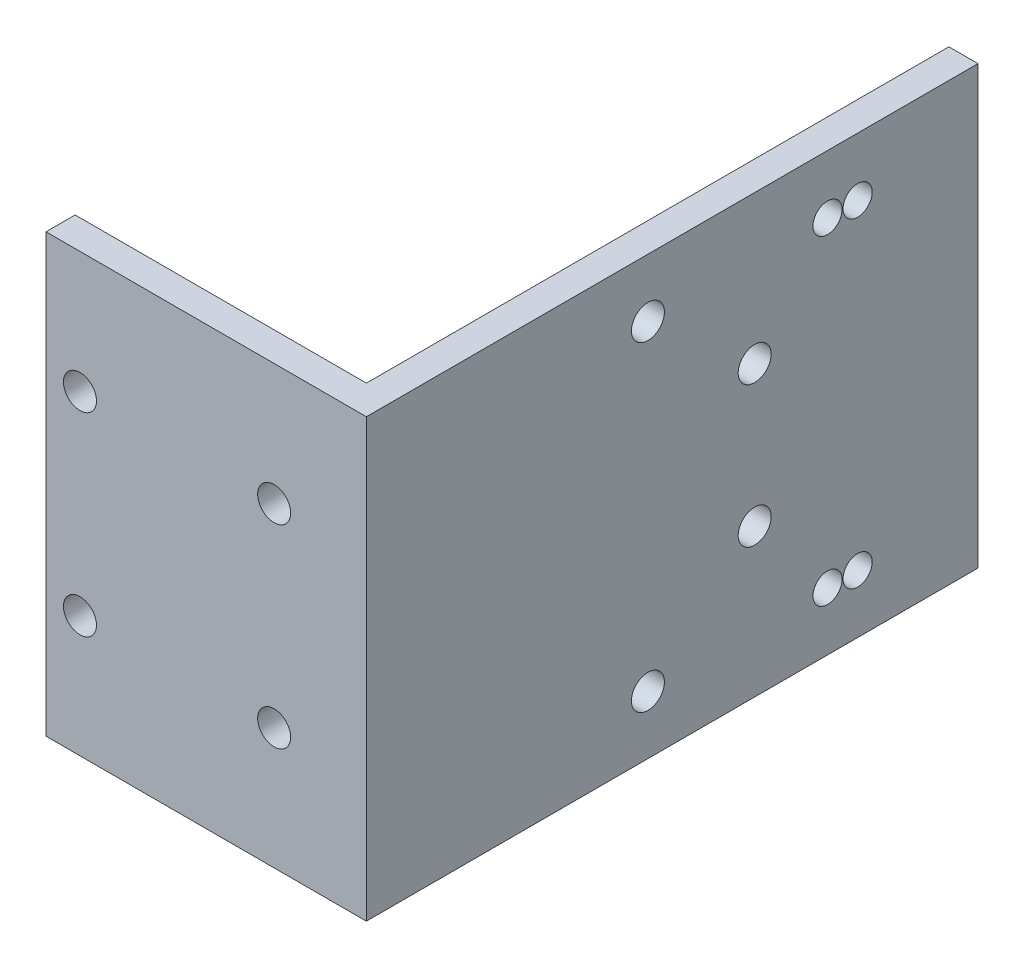
ISO-10303-21;
HEADER;
FILE_DESCRIPTION(('STEP AP214'),'2;1');
FILE_NAME('part.step','',(''),(''),'','','');
FILE_SCHEMA(('AUTOMOTIVE_DESIGN { 1 0 10303 214 1 1 1 1 }'));
ENDSEC;
DATA;
#1=APPLICATION_CONTEXT('core data for automotive mechanical design processes');
#2=APPLICATION_PROTOCOL_DEFINITION('international standard','automotive_design',2000,#1);
#3=PRODUCT_CONTEXT('',#1,'mechanical');
#4=PRODUCT('Part','Part','',(#3));
#5=PRODUCT_RELATED_PRODUCT_CATEGORY('part','',(#4));
#6=PRODUCT_DEFINITION_FORMATION('','',#4);
#7=PRODUCT_DEFINITION_CONTEXT('part definition',#1,'design');
#8=PRODUCT_DEFINITION('design','',#6,#7);
#9=PRODUCT_DEFINITION_SHAPE('','',#8);
#10=(LENGTH_UNIT() NAMED_UNIT(*) SI_UNIT(.MILLI.,.METRE.));
#11=(NAMED_UNIT(*) PLANE_ANGLE_UNIT() SI_UNIT($,.RADIAN.));
#12=(NAMED_UNIT(*) SI_UNIT($,.STERADIAN.) SOLID_ANGLE_UNIT());
#13=UNCERTAINTY_MEASURE_WITH_UNIT(LENGTH_MEASURE(1.E-05),#10,'distance_accuracy_value','');
#14=(GEOMETRIC_REPRESENTATION_CONTEXT(3) GLOBAL_UNCERTAINTY_ASSIGNED_CONTEXT((#13)) GLOBAL_UNIT_ASSIGNED_CONTEXT((#10,
#11,#12)) REPRESENTATION_CONTEXT('',''));
#15=CARTESIAN_POINT('',(0.,0.,0.));
#16=DIRECTION('',(0.,0.,1.));
#17=DIRECTION('',(1.,0.,0.));
#18=AXIS2_PLACEMENT_3D('',#15,#16,#17);
#19=CARTESIAN_POINT('',(0.,45.,0.));
#20=DIRECTION('',(1.,0.,0.));
#21=DIRECTION('',(0.,0.,-1.));
#22=AXIS2_PLACEMENT_3D('',#19,#20,#21);
#23=PLANE('',#22);
#24=DIRECTION('',(0.,0.,1.));
#25=VECTOR('',#24,1.);
#26=CARTESIAN_POINT('',(0.,0.,0.));
#27=LINE('',#26,#25);
#28=CARTESIAN_POINT('',(0.,0.,0.));
#29=VERTEX_POINT('',#28);
#30=CARTESIAN_POINT('',(0.,0.,3.));
#31=VERTEX_POINT('',#30);
#32=EDGE_CURVE('E119',#29,#31,#27,.T.);
#33=ORIENTED_EDGE('',*,*,#32,.T.);
#34=DIRECTION('',(0.,-1.,0.));
#35=VECTOR('',#34,1.);
#36=CARTESIAN_POINT('',(0.,45.,3.));
#37=LINE('',#36,#35);
#38=CARTESIAN_POINT('',(0.,45.,3.));
#39=VERTEX_POINT('',#38);
#40=EDGE_CURVE('E11',#39,#31,#37,.T.);
#41=ORIENTED_EDGE('',*,*,#40,.F.);
#42=DIRECTION('',(0.,0.,1.));
#43=VECTOR('',#42,1.);
#44=CARTESIAN_POINT('',(0.,45.,0.));
#45=LINE('',#44,#43);
#46=CARTESIAN_POINT('',(0.,45.,0.));
#47=VERTEX_POINT('',#46);
#48=EDGE_CURVE('E130',#47,#39,#45,.T.);
#49=ORIENTED_EDGE('',*,*,#48,.F.);
#50=DIRECTION('',(0.,-1.,0.));
#51=VECTOR('',#50,1.);
#52=CARTESIAN_POINT('',(0.,45.,0.));
#53=LINE('',#52,#51);
#54=EDGE_CURVE('E115',#47,#29,#53,.T.);
#55=ORIENTED_EDGE('',*,*,#54,.T.);
#56=EDGE_LOOP('',(#33,#41,#49,#55));
#57=FACE_BOUND('',#56,.T.);
#58=ADVANCED_FACE('F35',(#57),#23,.F.);
#59=CARTESIAN_POINT('',(0.,45.,3.));
#60=DIRECTION('',(0.,0.,-1.));
#61=DIRECTION('',(-1.,0.,0.));
#62=AXIS2_PLACEMENT_3D('',#59,#60,#61);
#63=PLANE('',#62);
#64=CARTESIAN_POINT('',(3.5,12.5,3.));
#65=DIRECTION('',(0.,0.,1.));
#66=DIRECTION('',(1.,0.,0.));
#67=AXIS2_PLACEMENT_3D('',#64,#65,#66);
#68=CIRCLE('',#67,1.7);
#69=CARTESIAN_POINT('',(5.2,12.5,3.));
#70=VERTEX_POINT('',#69);
#71=EDGE_CURVE('E364',#70,#70,#68,.T.);
#72=ORIENTED_EDGE('',*,*,#71,.F.);
#73=EDGE_LOOP('',(#72));
#74=FACE_BOUND('',#73,.T.);
#75=CARTESIAN_POINT('',(23.5,12.5,3.));
#76=DIRECTION('',(0.,0.,1.));
#77=DIRECTION('',(1.,0.,0.));
#78=AXIS2_PLACEMENT_3D('',#75,#76,#77);
#79=CIRCLE('',#78,1.7);
#80=CARTESIAN_POINT('',(25.2,12.5,3.));
#81=VERTEX_POINT('',#80);
#82=EDGE_CURVE('E358',#81,#81,#79,.T.);
#83=ORIENTED_EDGE('',*,*,#82,.F.);
#84=EDGE_LOOP('',(#83));
#85=FACE_BOUND('',#84,.T.);
#86=CARTESIAN_POINT('',(23.5,32.5,3.));
#87=DIRECTION('',(0.,0.,1.));
#88=DIRECTION('',(1.,0.,0.));
#89=AXIS2_PLACEMENT_3D('',#86,#87,#88);
#90=CIRCLE('',#89,1.7);
#91=CARTESIAN_POINT('',(25.2,32.5,3.));
#92=VERTEX_POINT('',#91);
#93=EDGE_CURVE('E352',#92,#92,#90,.T.);
#94=ORIENTED_EDGE('',*,*,#93,.F.);
#95=EDGE_LOOP('',(#94));
#96=FACE_BOUND('',#95,.T.);
#97=CARTESIAN_POINT('',(3.5,32.5,3.));
#98=DIRECTION('',(0.,0.,1.));
#99=DIRECTION('',(1.,0.,0.));
#100=AXIS2_PLACEMENT_3D('',#97,#98,#99);
#101=CIRCLE('',#100,1.7);
#102=CARTESIAN_POINT('',(5.2,32.5,3.));
#103=VERTEX_POINT('',#102);
#104=EDGE_CURVE('E340',#103,#103,#101,.T.);
#105=ORIENTED_EDGE('',*,*,#104,.F.);
#106=EDGE_LOOP('',(#105));
#107=FACE_BOUND('',#106,.T.);
#108=DIRECTION('',(1.,0.,0.));
#109=VECTOR('',#108,1.);
#110=CARTESIAN_POINT('',(0.,0.,3.));
#111=LINE('',#110,#109);
#112=CARTESIAN_POINT('',(33.,0.,3.));
#113=VERTEX_POINT('',#112);
#114=EDGE_CURVE('E122',#31,#113,#111,.T.);
#115=ORIENTED_EDGE('',*,*,#114,.T.);
#116=DIRECTION('',(0.,-1.,0.));
#117=VECTOR('',#116,1.);
#118=CARTESIAN_POINT('',(33.,45.,3.));
#119=LINE('',#118,#117);
#120=CARTESIAN_POINT('',(33.,45.,3.));
#121=VERTEX_POINT('',#120);
#122=EDGE_CURVE('E43',#121,#113,#119,.T.);
#123=ORIENTED_EDGE('',*,*,#122,.F.);
#124=DIRECTION('',(1.,0.,0.));
#125=VECTOR('',#124,1.);
#126=CARTESIAN_POINT('',(0.,45.,3.));
#127=LINE('',#126,#125);
#128=EDGE_CURVE('E88',#39,#121,#127,.T.);
#129=ORIENTED_EDGE('',*,*,#128,.F.);
#130=ORIENTED_EDGE('',*,*,#40,.T.);
#131=EDGE_LOOP('',(#115,#123,#129,#130));
#132=FACE_BOUND('',#131,.T.);
#133=ADVANCED_FACE('F158',(#74,#85,#96,#107,#132),#63,.F.);
#134=CARTESIAN_POINT('',(33.,45.,3.));
#135=DIRECTION('',(-1.,0.,0.));
#136=DIRECTION('',(0.,0.,1.));
#137=AXIS2_PLACEMENT_3D('',#134,#135,#136);
#138=PLANE('',#137);
#139=CARTESIAN_POINT('',(33.,6.00000000000001,-44.5));
#140=DIRECTION('',(1.,0.,0.));
#141=DIRECTION('',(0.,0.,1.));
#142=AXIS2_PLACEMENT_3D('',#139,#140,#141);
#143=CIRCLE('',#142,1.5);
#144=CARTESIAN_POINT('',(33.,6.00000000000001,-43.));
#145=VERTEX_POINT('',#144);
#146=EDGE_CURVE('E412',#145,#145,#143,.T.);
#147=ORIENTED_EDGE('',*,*,#146,.F.);
#148=EDGE_LOOP('',(#147));
#149=FACE_BOUND('',#148,.T.);
#150=CARTESIAN_POINT('',(33.,6.00000000000001,-47.6));
#151=DIRECTION('',(1.,0.,0.));
#152=DIRECTION('',(0.,0.,1.));
#153=AXIS2_PLACEMENT_3D('',#150,#151,#152);
#154=CIRCLE('',#153,1.5);
#155=CARTESIAN_POINT('',(33.,6.00000000000001,-46.1));
#156=VERTEX_POINT('',#155);
#157=EDGE_CURVE('E406',#156,#156,#154,.T.);
#158=ORIENTED_EDGE('',*,*,#157,.F.);
#159=EDGE_LOOP('',(#158));
#160=FACE_BOUND('',#159,.T.);
#161=CARTESIAN_POINT('',(33.,39.,-47.6));
#162=DIRECTION('',(1.,0.,0.));
#163=DIRECTION('',(0.,0.,-1.));
#164=AXIS2_PLACEMENT_3D('',#161,#162,#163);
#165=CIRCLE('',#164,1.5);
#166=CARTESIAN_POINT('',(33.,39.,-49.1));
#167=VERTEX_POINT('',#166);
#168=EDGE_CURVE('E400',#167,#167,#165,.T.);
#169=ORIENTED_EDGE('',*,*,#168,.F.);
#170=EDGE_LOOP('',(#169));
#171=FACE_BOUND('',#170,.T.);
#172=CARTESIAN_POINT('',(33.,39.,-44.5));
#173=DIRECTION('',(1.,0.,0.));
#174=DIRECTION('',(0.,0.,-1.));
#175=AXIS2_PLACEMENT_3D('',#172,#173,#174);
#176=CIRCLE('',#175,1.5);
#177=CARTESIAN_POINT('',(33.,39.,-46.));
#178=VERTEX_POINT('',#177);
#179=EDGE_CURVE('E394',#178,#178,#176,.T.);
#180=ORIENTED_EDGE('',*,*,#179,.F.);
#181=EDGE_LOOP('',(#180));
#182=FACE_BOUND('',#181,.T.);
#183=CARTESIAN_POINT('',(33.,29.75,-37.));
#184=DIRECTION('',(1.,0.,0.));
#185=DIRECTION('',(0.,0.,-1.));
#186=AXIS2_PLACEMENT_3D('',#183,#184,#185);
#187=CIRCLE('',#186,1.7);
#188=CARTESIAN_POINT('',(33.,29.75,-38.7));
#189=VERTEX_POINT('',#188);
#190=EDGE_CURVE('E388',#189,#189,#187,.T.);
#191=ORIENTED_EDGE('',*,*,#190,.F.);
#192=EDGE_LOOP('',(#191));
#193=FACE_BOUND('',#192,.T.);
#194=CARTESIAN_POINT('',(33.,15.25,-37.));
#195=DIRECTION('',(1.,0.,0.));
#196=DIRECTION('',(0.,0.,-1.));
#197=AXIS2_PLACEMENT_3D('',#194,#195,#196);
#198=CIRCLE('',#197,1.7);
#199=CARTESIAN_POINT('',(33.,15.25,-38.7));
#200=VERTEX_POINT('',#199);
#201=EDGE_CURVE('E382',#200,#200,#198,.T.);
#202=ORIENTED_EDGE('',*,*,#201,.F.);
#203=EDGE_LOOP('',(#202));
#204=FACE_BOUND('',#203,.T.);
#205=CARTESIAN_POINT('',(33.,39.,-26.));
#206=DIRECTION('',(1.,0.,0.));
#207=DIRECTION('',(0.,0.,-1.));
#208=AXIS2_PLACEMENT_3D('',#205,#206,#207);
#209=CIRCLE('',#208,1.7);
#210=CARTESIAN_POINT('',(33.,39.,-27.7));
#211=VERTEX_POINT('',#210);
#212=EDGE_CURVE('E376',#211,#211,#209,.T.);
#213=ORIENTED_EDGE('',*,*,#212,.F.);
#214=EDGE_LOOP('',(#213));
#215=FACE_BOUND('',#214,.T.);
#216=CARTESIAN_POINT('',(33.,6.,-26.));
#217=DIRECTION('',(1.,0.,0.));
#218=DIRECTION('',(0.,0.,-1.));
#219=AXIS2_PLACEMENT_3D('',#216,#217,#218);
#220=CIRCLE('',#219,1.7);
#221=CARTESIAN_POINT('',(33.,6.,-27.7));
#222=VERTEX_POINT('',#221);
#223=EDGE_CURVE('E370',#222,#222,#220,.T.);
#224=ORIENTED_EDGE('',*,*,#223,.F.);
#225=EDGE_LOOP('',(#224));
#226=FACE_BOUND('',#225,.T.);
#227=DIRECTION('',(0.,0.,-1.));
#228=VECTOR('',#227,1.);
#229=CARTESIAN_POINT('',(33.,0.,3.));
#230=LINE('',#229,#228);
#231=CARTESIAN_POINT('',(33.,0.,-60.));
#232=VERTEX_POINT('',#231);
#233=EDGE_CURVE('E125',#113,#232,#230,.T.);
#234=ORIENTED_EDGE('',*,*,#233,.T.);
#235=DIRECTION('',(0.,-1.,0.));
#236=VECTOR('',#235,1.);
#237=CARTESIAN_POINT('',(33.,45.,-60.));
#238=LINE('',#237,#236);
#239=CARTESIAN_POINT('',(33.,45.,-60.));
#240=VERTEX_POINT('',#239);
#241=EDGE_CURVE('E110',#240,#232,#238,.T.);
#242=ORIENTED_EDGE('',*,*,#241,.F.);
#243=DIRECTION('',(0.,0.,-1.));
#244=VECTOR('',#243,1.);
#245=CARTESIAN_POINT('',(33.,45.,3.));
#246=LINE('',#245,#244);
#247=EDGE_CURVE('E101',#121,#240,#246,.T.);
#248=ORIENTED_EDGE('',*,*,#247,.F.);
#249=ORIENTED_EDGE('',*,*,#122,.T.);
#250=EDGE_LOOP('',(#234,#242,#248,#249));
#251=FACE_BOUND('',#250,.T.);
#252=ADVANCED_FACE('F136',(#149,#160,#171,#182,#193,#204,#215,#226,#251),#138,.F.);
#253=CARTESIAN_POINT('',(30.,45.,-60.));
#254=DIRECTION('',(0.,0.,1.));
#255=DIRECTION('',(1.,0.,0.));
#256=AXIS2_PLACEMENT_3D('',#253,#254,#255);
#257=PLANE('',#256);
#258=DIRECTION('',(-1.,0.,0.));
#259=VECTOR('',#258,1.);
#260=CARTESIAN_POINT('',(30.,0.,-60.));
#261=LINE('',#260,#259);
#262=CARTESIAN_POINT('',(30.,0.,-60.));
#263=VERTEX_POINT('',#262);
#264=EDGE_CURVE('E109',#232,#263,#261,.T.);
#265=ORIENTED_EDGE('',*,*,#264,.T.);
#266=DIRECTION('',(0.,-1.,0.));
#267=VECTOR('',#266,1.);
#268=CARTESIAN_POINT('',(30.,45.,-60.));
#269=LINE('',#268,#267);
#270=CARTESIAN_POINT('',(30.,45.,-60.));
#271=VERTEX_POINT('',#270);
#272=EDGE_CURVE('E106',#271,#263,#269,.T.);
#273=ORIENTED_EDGE('',*,*,#272,.F.);
#274=DIRECTION('',(-1.,0.,0.));
#275=VECTOR('',#274,1.);
#276=CARTESIAN_POINT('',(30.,45.,-60.));
#277=LINE('',#276,#275);
#278=EDGE_CURVE('E95',#240,#271,#277,.T.);
#279=ORIENTED_EDGE('',*,*,#278,.F.);
#280=ORIENTED_EDGE('',*,*,#241,.T.);
#281=EDGE_LOOP('',(#265,#273,#279,#280));
#282=FACE_BOUND('',#281,.T.);
#283=ADVANCED_FACE('F107',(#282),#257,.F.);
#284=CARTESIAN_POINT('',(30.,45.,0.));
#285=DIRECTION('',(1.,0.,0.));
#286=DIRECTION('',(0.,0.,-1.));
#287=AXIS2_PLACEMENT_3D('',#284,#285,#286);
#288=PLANE('',#287);
#289=CARTESIAN_POINT('',(30.,6.00000000000001,-44.5));
#290=DIRECTION('',(1.,0.,0.));
#291=DIRECTION('',(0.,0.,-1.));
#292=AXIS2_PLACEMENT_3D('',#289,#290,#291);
#293=CIRCLE('',#292,1.5);
#294=CARTESIAN_POINT('',(30.,6.00000000000001,-46.));
#295=VERTEX_POINT('',#294);
#296=EDGE_CURVE('E409',#295,#295,#293,.F.);
#297=ORIENTED_EDGE('',*,*,#296,.F.);
#298=EDGE_LOOP('',(#297));
#299=FACE_BOUND('',#298,.T.);
#300=CARTESIAN_POINT('',(30.,6.00000000000001,-47.6));
#301=DIRECTION('',(1.,0.,0.));
#302=DIRECTION('',(0.,0.,-1.));
#303=AXIS2_PLACEMENT_3D('',#300,#301,#302);
#304=CIRCLE('',#303,1.5);
#305=CARTESIAN_POINT('',(30.,6.00000000000001,-49.1));
#306=VERTEX_POINT('',#305);
#307=EDGE_CURVE('E403',#306,#306,#304,.F.);
#308=ORIENTED_EDGE('',*,*,#307,.F.);
#309=EDGE_LOOP('',(#308));
#310=FACE_BOUND('',#309,.T.);
#311=CARTESIAN_POINT('',(30.,39.,-47.6));
#312=DIRECTION('',(1.,0.,0.));
#313=DIRECTION('',(0.,0.,-1.));
#314=AXIS2_PLACEMENT_3D('',#311,#312,#313);
#315=CIRCLE('',#314,1.5);
#316=CARTESIAN_POINT('',(30.,39.,-49.1));
#317=VERTEX_POINT('',#316);
#318=EDGE_CURVE('E397',#317,#317,#315,.F.);
#319=ORIENTED_EDGE('',*,*,#318,.F.);
#320=EDGE_LOOP('',(#319));
#321=FACE_BOUND('',#320,.T.);
#322=CARTESIAN_POINT('',(30.,39.,-44.5));
#323=DIRECTION('',(1.,0.,0.));
#324=DIRECTION('',(0.,0.,-1.));
#325=AXIS2_PLACEMENT_3D('',#322,#323,#324);
#326=CIRCLE('',#325,1.5);
#327=CARTESIAN_POINT('',(30.,39.,-46.));
#328=VERTEX_POINT('',#327);
#329=EDGE_CURVE('E391',#328,#328,#326,.F.);
#330=ORIENTED_EDGE('',*,*,#329,.F.);
#331=EDGE_LOOP('',(#330));
#332=FACE_BOUND('',#331,.T.);
#333=CARTESIAN_POINT('',(30.,29.75,-37.));
#334=DIRECTION('',(1.,0.,0.));
#335=DIRECTION('',(0.,0.,-1.));
#336=AXIS2_PLACEMENT_3D('',#333,#334,#335);
#337=CIRCLE('',#336,1.7);
#338=CARTESIAN_POINT('',(30.,29.75,-38.7));
#339=VERTEX_POINT('',#338);
#340=EDGE_CURVE('E385',#339,#339,#337,.F.);
#341=ORIENTED_EDGE('',*,*,#340,.F.);
#342=EDGE_LOOP('',(#341));
#343=FACE_BOUND('',#342,.T.);
#344=CARTESIAN_POINT('',(30.,15.25,-37.));
#345=DIRECTION('',(1.,0.,0.));
#346=DIRECTION('',(0.,0.,-1.));
#347=AXIS2_PLACEMENT_3D('',#344,#345,#346);
#348=CIRCLE('',#347,1.7);
#349=CARTESIAN_POINT('',(30.,15.25,-38.7));
#350=VERTEX_POINT('',#349);
#351=EDGE_CURVE('E379',#350,#350,#348,.F.);
#352=ORIENTED_EDGE('',*,*,#351,.F.);
#353=EDGE_LOOP('',(#352));
#354=FACE_BOUND('',#353,.T.);
#355=CARTESIAN_POINT('',(30.,39.,-26.));
#356=DIRECTION('',(1.,0.,0.));
#357=DIRECTION('',(0.,0.,-1.));
#358=AXIS2_PLACEMENT_3D('',#355,#356,#357);
#359=CIRCLE('',#358,1.7);
#360=CARTESIAN_POINT('',(30.,39.,-27.7));
#361=VERTEX_POINT('',#360);
#362=EDGE_CURVE('E373',#361,#361,#359,.F.);
#363=ORIENTED_EDGE('',*,*,#362,.F.);
#364=EDGE_LOOP('',(#363));
#365=FACE_BOUND('',#364,.T.);
#366=CARTESIAN_POINT('',(30.,6.,-26.));
#367=DIRECTION('',(1.,0.,0.));
#368=DIRECTION('',(0.,0.,-1.));
#369=AXIS2_PLACEMENT_3D('',#366,#367,#368);
#370=CIRCLE('',#369,1.7);
#371=CARTESIAN_POINT('',(30.,6.,-27.7));
#372=VERTEX_POINT('',#371);
#373=EDGE_CURVE('E367',#372,#372,#370,.F.);
#374=ORIENTED_EDGE('',*,*,#373,.F.);
#375=EDGE_LOOP('',(#374));
#376=FACE_BOUND('',#375,.T.);
#377=DIRECTION('',(0.,0.,1.));
#378=VECTOR('',#377,1.);
#379=CARTESIAN_POINT('',(30.,0.,0.));
#380=LINE('',#379,#378);
#381=CARTESIAN_POINT('',(30.,0.,0.));
#382=VERTEX_POINT('',#381);
#383=EDGE_CURVE('E74',#263,#382,#380,.T.);
#384=ORIENTED_EDGE('',*,*,#383,.T.);
#385=DIRECTION('',(0.,-1.,0.));
#386=VECTOR('',#385,1.);
#387=CARTESIAN_POINT('',(30.,45.,0.));
#388=LINE('',#387,#386);
#389=CARTESIAN_POINT('',(30.,45.,0.));
#390=VERTEX_POINT('',#389);
#391=EDGE_CURVE('E111',#390,#382,#388,.T.);
#392=ORIENTED_EDGE('',*,*,#391,.F.);
#393=DIRECTION('',(0.,0.,1.));
#394=VECTOR('',#393,1.);
#395=CARTESIAN_POINT('',(30.,45.,0.));
#396=LINE('',#395,#394);
#397=EDGE_CURVE('E99',#271,#390,#396,.T.);
#398=ORIENTED_EDGE('',*,*,#397,.F.);
#399=ORIENTED_EDGE('',*,*,#272,.T.);
#400=EDGE_LOOP('',(#384,#392,#398,#399));
#401=FACE_BOUND('',#400,.T.);
#402=ADVANCED_FACE('F113',(#299,#310,#321,#332,#343,#354,#365,#376,#401),#288,.F.);
#403=CARTESIAN_POINT('',(0.,45.,0.));
#404=DIRECTION('',(0.,0.,1.));
#405=DIRECTION('',(1.,0.,0.));
#406=AXIS2_PLACEMENT_3D('',#403,#404,#405);
#407=PLANE('',#406);
#408=CARTESIAN_POINT('',(3.5,12.5,0.));
#409=DIRECTION('',(0.,0.,1.));
#410=DIRECTION('',(1.,0.,0.));
#411=AXIS2_PLACEMENT_3D('',#408,#409,#410);
#412=CIRCLE('',#411,1.7);
#413=CARTESIAN_POINT('',(5.2,12.5,0.));
#414=VERTEX_POINT('',#413);
#415=EDGE_CURVE('E361',#414,#414,#412,.F.);
#416=ORIENTED_EDGE('',*,*,#415,.F.);
#417=EDGE_LOOP('',(#416));
#418=FACE_BOUND('',#417,.T.);
#419=CARTESIAN_POINT('',(23.5,12.5,0.));
#420=DIRECTION('',(0.,0.,1.));
#421=DIRECTION('',(1.,0.,0.));
#422=AXIS2_PLACEMENT_3D('',#419,#420,#421);
#423=CIRCLE('',#422,1.7);
#424=CARTESIAN_POINT('',(25.2,12.5,0.));
#425=VERTEX_POINT('',#424);
#426=EDGE_CURVE('E355',#425,#425,#423,.F.);
#427=ORIENTED_EDGE('',*,*,#426,.F.);
#428=EDGE_LOOP('',(#427));
#429=FACE_BOUND('',#428,.T.);
#430=CARTESIAN_POINT('',(23.5,32.5,0.));
#431=DIRECTION('',(0.,0.,1.));
#432=DIRECTION('',(1.,0.,0.));
#433=AXIS2_PLACEMENT_3D('',#430,#431,#432);
#434=CIRCLE('',#433,1.7);
#435=CARTESIAN_POINT('',(25.2,32.5,0.));
#436=VERTEX_POINT('',#435);
#437=EDGE_CURVE('E345',#436,#436,#434,.F.);
#438=ORIENTED_EDGE('',*,*,#437,.F.);
#439=EDGE_LOOP('',(#438));
#440=FACE_BOUND('',#439,.T.);
#441=CARTESIAN_POINT('',(3.5,32.5,0.));
#442=DIRECTION('',(0.,0.,1.));
#443=DIRECTION('',(1.,0.,0.));
#444=AXIS2_PLACEMENT_3D('',#441,#442,#443);
#445=CIRCLE('',#444,1.7);
#446=CARTESIAN_POINT('',(5.2,32.5,0.));
#447=VERTEX_POINT('',#446);
#448=EDGE_CURVE('E123',#447,#447,#445,.F.);
#449=ORIENTED_EDGE('',*,*,#448,.F.);
#450=EDGE_LOOP('',(#449));
#451=FACE_BOUND('',#450,.T.);
#452=DIRECTION('',(-1.,0.,0.));
#453=VECTOR('',#452,1.);
#454=CARTESIAN_POINT('',(0.,0.,0.));
#455=LINE('',#454,#453);
#456=EDGE_CURVE('E80',#382,#29,#455,.T.);
#457=ORIENTED_EDGE('',*,*,#456,.T.);
#458=ORIENTED_EDGE('',*,*,#54,.F.);
#459=DIRECTION('',(-1.,0.,0.));
#460=VECTOR('',#459,1.);
#461=CARTESIAN_POINT('',(0.,45.,0.));
#462=LINE('',#461,#460);
#463=EDGE_CURVE('E51',#390,#47,#462,.T.);
#464=ORIENTED_EDGE('',*,*,#463,.F.);
#465=ORIENTED_EDGE('',*,*,#391,.T.);
#466=EDGE_LOOP('',(#457,#458,#464,#465));
#467=FACE_BOUND('',#466,.T.);
#468=ADVANCED_FACE('F143',(#418,#429,#440,#451,#467),#407,.F.);
#469=CARTESIAN_POINT('',(0.,45.,0.));
#470=DIRECTION('',(0.,1.,0.));
#471=DIRECTION('',(0.,0.,1.));
#472=AXIS2_PLACEMENT_3D('',#469,#470,#471);
#473=PLANE('',#472);
#474=ORIENTED_EDGE('',*,*,#48,.T.);
#475=ORIENTED_EDGE('',*,*,#128,.T.);
#476=ORIENTED_EDGE('',*,*,#247,.T.);
#477=ORIENTED_EDGE('',*,*,#278,.T.);
#478=ORIENTED_EDGE('',*,*,#397,.T.);
#479=ORIENTED_EDGE('',*,*,#463,.T.);
#480=EDGE_LOOP('',(#474,#475,#476,#477,#478,#479));
#481=FACE_BOUND('',#480,.T.);
#482=ADVANCED_FACE('F97',(#481),#473,.T.);
#483=CARTESIAN_POINT('',(0.,0.,0.));
#484=DIRECTION('',(0.,1.,0.));
#485=DIRECTION('',(0.,0.,1.));
#486=AXIS2_PLACEMENT_3D('',#483,#484,#485);
#487=PLANE('',#486);
#488=ORIENTED_EDGE('',*,*,#32,.F.);
#489=ORIENTED_EDGE('',*,*,#456,.F.);
#490=ORIENTED_EDGE('',*,*,#383,.F.);
#491=ORIENTED_EDGE('',*,*,#264,.F.);
#492=ORIENTED_EDGE('',*,*,#233,.F.);
#493=ORIENTED_EDGE('',*,*,#114,.F.);
#494=EDGE_LOOP('',(#488,#489,#490,#491,#492,#493));
#495=FACE_BOUND('',#494,.T.);
#496=ADVANCED_FACE('F139',(#495),#487,.F.);
#497=CARTESIAN_POINT('',(3.5,32.5,-60.001));
#498=DIRECTION('',(0.,0.,1.));
#499=DIRECTION('',(1.,0.,0.));
#500=AXIS2_PLACEMENT_3D('',#497,#498,#499);
#501=CYLINDRICAL_SURFACE('',#500,1.7);
#502=ORIENTED_EDGE('',*,*,#104,.T.);
#503=EDGE_LOOP('',(#502));
#504=FACE_BOUND('',#503,.T.);
#505=ORIENTED_EDGE('',*,*,#448,.T.);
#506=EDGE_LOOP('',(#505));
#507=FACE_BOUND('',#506,.T.);
#508=ADVANCED_FACE('F284',(#504,#507),#501,.F.);
#509=CARTESIAN_POINT('',(23.5,32.5,-60.001));
#510=DIRECTION('',(0.,0.,1.));
#511=DIRECTION('',(1.,0.,0.));
#512=AXIS2_PLACEMENT_3D('',#509,#510,#511);
#513=CYLINDRICAL_SURFACE('',#512,1.7);
#514=ORIENTED_EDGE('',*,*,#93,.T.);
#515=EDGE_LOOP('',(#514));
#516=FACE_BOUND('',#515,.T.);
#517=ORIENTED_EDGE('',*,*,#437,.T.);
#518=EDGE_LOOP('',(#517));
#519=FACE_BOUND('',#518,.T.);
#520=ADVANCED_FACE('F280',(#516,#519),#513,.F.);
#521=CARTESIAN_POINT('',(23.5,12.5,-60.001));
#522=DIRECTION('',(0.,0.,1.));
#523=DIRECTION('',(1.,0.,0.));
#524=AXIS2_PLACEMENT_3D('',#521,#522,#523);
#525=CYLINDRICAL_SURFACE('',#524,1.7);
#526=ORIENTED_EDGE('',*,*,#82,.T.);
#527=EDGE_LOOP('',(#526));
#528=FACE_BOUND('',#527,.T.);
#529=ORIENTED_EDGE('',*,*,#426,.T.);
#530=EDGE_LOOP('',(#529));
#531=FACE_BOUND('',#530,.T.);
#532=ADVANCED_FACE('F276',(#528,#531),#525,.F.);
#533=CARTESIAN_POINT('',(3.5,12.5,-60.001));
#534=DIRECTION('',(0.,0.,1.));
#535=DIRECTION('',(1.,0.,0.));
#536=AXIS2_PLACEMENT_3D('',#533,#534,#535);
#537=CYLINDRICAL_SURFACE('',#536,1.7);
#538=ORIENTED_EDGE('',*,*,#71,.T.);
#539=EDGE_LOOP('',(#538));
#540=FACE_BOUND('',#539,.T.);
#541=ORIENTED_EDGE('',*,*,#415,.T.);
#542=EDGE_LOOP('',(#541));
#543=FACE_BOUND('',#542,.T.);
#544=ADVANCED_FACE('F196',(#540,#543),#537,.F.);
#545=CARTESIAN_POINT('',(-0.001000000000001,6.,-26.));
#546=DIRECTION('',(1.,0.,0.));
#547=DIRECTION('',(0.,0.,-1.));
#548=AXIS2_PLACEMENT_3D('',#545,#546,#547);
#549=CYLINDRICAL_SURFACE('',#548,1.7);
#550=ORIENTED_EDGE('',*,*,#223,.T.);
#551=EDGE_LOOP('',(#550));
#552=FACE_BOUND('',#551,.T.);
#553=ORIENTED_EDGE('',*,*,#373,.T.);
#554=EDGE_LOOP('',(#553));
#555=FACE_BOUND('',#554,.T.);
#556=ADVANCED_FACE('F190',(#552,#555),#549,.F.);
#557=CARTESIAN_POINT('',(-0.001000000000001,39.,-26.));
#558=DIRECTION('',(1.,0.,0.));
#559=DIRECTION('',(0.,0.,-1.));
#560=AXIS2_PLACEMENT_3D('',#557,#558,#559);
#561=CYLINDRICAL_SURFACE('',#560,1.7);
#562=ORIENTED_EDGE('',*,*,#212,.T.);
#563=EDGE_LOOP('',(#562));
#564=FACE_BOUND('',#563,.T.);
#565=ORIENTED_EDGE('',*,*,#362,.T.);
#566=EDGE_LOOP('',(#565));
#567=FACE_BOUND('',#566,.T.);
#568=ADVANCED_FACE('F195',(#564,#567),#561,.F.);
#569=CARTESIAN_POINT('',(-0.001000000000001,15.25,-37.));
#570=DIRECTION('',(1.,0.,0.));
#571=DIRECTION('',(0.,0.,-1.));
#572=AXIS2_PLACEMENT_3D('',#569,#570,#571);
#573=CYLINDRICAL_SURFACE('',#572,1.7);
#574=ORIENTED_EDGE('',*,*,#201,.T.);
#575=EDGE_LOOP('',(#574));
#576=FACE_BOUND('',#575,.T.);
#577=ORIENTED_EDGE('',*,*,#351,.T.);
#578=EDGE_LOOP('',(#577));
#579=FACE_BOUND('',#578,.T.);
#580=ADVANCED_FACE('F208',(#576,#579),#573,.F.);
#581=CARTESIAN_POINT('',(-0.001000000000001,29.75,-37.));
#582=DIRECTION('',(1.,0.,0.));
#583=DIRECTION('',(0.,0.,-1.));
#584=AXIS2_PLACEMENT_3D('',#581,#582,#583);
#585=CYLINDRICAL_SURFACE('',#584,1.7);
#586=ORIENTED_EDGE('',*,*,#190,.T.);
#587=EDGE_LOOP('',(#586));
#588=FACE_BOUND('',#587,.T.);
#589=ORIENTED_EDGE('',*,*,#340,.T.);
#590=EDGE_LOOP('',(#589));
#591=FACE_BOUND('',#590,.T.);
#592=ADVANCED_FACE('F218',(#588,#591),#585,.F.);
#593=CARTESIAN_POINT('',(-0.001000000000001,39.,-44.5));
#594=DIRECTION('',(1.,0.,0.));
#595=DIRECTION('',(0.,0.,-1.));
#596=AXIS2_PLACEMENT_3D('',#593,#594,#595);
#597=CYLINDRICAL_SURFACE('',#596,1.5);
#598=ORIENTED_EDGE('',*,*,#179,.T.);
#599=EDGE_LOOP('',(#598));
#600=FACE_BOUND('',#599,.T.);
#601=ORIENTED_EDGE('',*,*,#329,.T.);
#602=EDGE_LOOP('',(#601));
#603=FACE_BOUND('',#602,.T.);
#604=ADVANCED_FACE('F228',(#600,#603),#597,.F.);
#605=CARTESIAN_POINT('',(-0.001000000000001,39.,-47.6));
#606=DIRECTION('',(1.,0.,0.));
#607=DIRECTION('',(0.,0.,-1.));
#608=AXIS2_PLACEMENT_3D('',#605,#606,#607);
#609=CYLINDRICAL_SURFACE('',#608,1.5);
#610=ORIENTED_EDGE('',*,*,#168,.T.);
#611=EDGE_LOOP('',(#610));
#612=FACE_BOUND('',#611,.T.);
#613=ORIENTED_EDGE('',*,*,#318,.T.);
#614=EDGE_LOOP('',(#613));
#615=FACE_BOUND('',#614,.T.);
#616=ADVANCED_FACE('F238',(#612,#615),#609,.F.);
#617=CARTESIAN_POINT('',(-0.001000000000001,6.00000000000001,-47.6));
#618=DIRECTION('',(1.,0.,0.));
#619=DIRECTION('',(0.,0.,-1.));
#620=AXIS2_PLACEMENT_3D('',#617,#618,#619);
#621=CYLINDRICAL_SURFACE('',#620,1.5);
#622=ORIENTED_EDGE('',*,*,#157,.T.);
#623=EDGE_LOOP('',(#622));
#624=FACE_BOUND('',#623,.T.);
#625=ORIENTED_EDGE('',*,*,#307,.T.);
#626=EDGE_LOOP('',(#625));
#627=FACE_BOUND('',#626,.T.);
#628=ADVANCED_FACE('F248',(#624,#627),#621,.F.);
#629=CARTESIAN_POINT('',(-0.001000000000001,6.00000000000001,-44.5));
#630=DIRECTION('',(1.,0.,0.));
#631=DIRECTION('',(0.,0.,-1.));
#632=AXIS2_PLACEMENT_3D('',#629,#630,#631);
#633=CYLINDRICAL_SURFACE('',#632,1.5);
#634=ORIENTED_EDGE('',*,*,#146,.T.);
#635=EDGE_LOOP('',(#634));
#636=FACE_BOUND('',#635,.T.);
#637=ORIENTED_EDGE('',*,*,#296,.T.);
#638=EDGE_LOOP('',(#637));
#639=FACE_BOUND('',#638,.T.);
#640=ADVANCED_FACE('F258',(#636,#639),#633,.F.);
#641=CLOSED_SHELL('',(#58,#133,#252,#283,#402,#468,#482,#496,#508,#520,#532,#544,#556,#568,#580,
#592,#604,#616,#628,#640));
#642=MANIFOLD_SOLID_BREP('B2',#641);
#643=ADVANCED_BREP_SHAPE_REPRESENTATION('',(#18,#642),#14);
#644=SHAPE_DEFINITION_REPRESENTATION(#9,#643);
ENDSEC;
END-ISO-10303-21;
